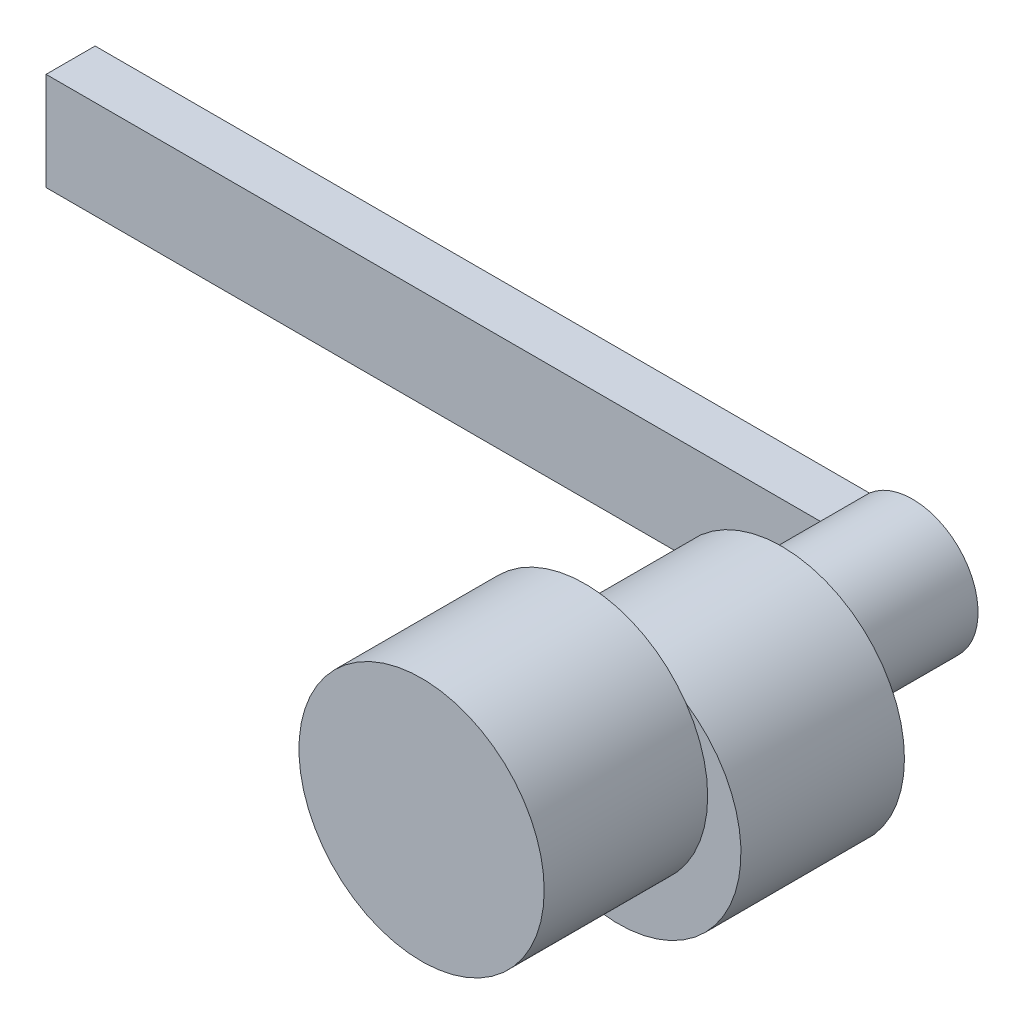
ISO-10303-21;
HEADER;
FILE_DESCRIPTION(('STEP AP214'),'2;1');
FILE_NAME('part.step','',(''),(''),'','','');
FILE_SCHEMA(('AUTOMOTIVE_DESIGN { 1 0 10303 214 1 1 1 1 }'));
ENDSEC;
DATA;
#1=APPLICATION_CONTEXT('core data for automotive mechanical design processes');
#2=APPLICATION_PROTOCOL_DEFINITION('international standard','automotive_design',2000,#1);
#3=PRODUCT_CONTEXT('',#1,'mechanical');
#4=PRODUCT('Part','Part','',(#3));
#5=PRODUCT_RELATED_PRODUCT_CATEGORY('part','',(#4));
#6=PRODUCT_DEFINITION_FORMATION('','',#4);
#7=PRODUCT_DEFINITION_CONTEXT('part definition',#1,'design');
#8=PRODUCT_DEFINITION('design','',#6,#7);
#9=PRODUCT_DEFINITION_SHAPE('','',#8);
#10=(LENGTH_UNIT() NAMED_UNIT(*) SI_UNIT(.MILLI.,.METRE.));
#11=(NAMED_UNIT(*) PLANE_ANGLE_UNIT() SI_UNIT($,.RADIAN.));
#12=(NAMED_UNIT(*) SI_UNIT($,.STERADIAN.) SOLID_ANGLE_UNIT());
#13=UNCERTAINTY_MEASURE_WITH_UNIT(LENGTH_MEASURE(1.E-05),#10,'distance_accuracy_value','');
#14=(GEOMETRIC_REPRESENTATION_CONTEXT(3) GLOBAL_UNCERTAINTY_ASSIGNED_CONTEXT((#13)) GLOBAL_UNIT_ASSIGNED_CONTEXT((#10,
#11,#12)) REPRESENTATION_CONTEXT('',''));
#15=CARTESIAN_POINT('',(0.,0.,0.));
#16=DIRECTION('',(0.,0.,1.));
#17=DIRECTION('',(1.,0.,0.));
#18=AXIS2_PLACEMENT_3D('',#15,#16,#17);
#19=CARTESIAN_POINT('',(2.,0.,20.));
#20=DIRECTION('',(0.,0.,1.));
#21=DIRECTION('',(1.,0.,0.));
#22=AXIS2_PLACEMENT_3D('',#19,#20,#21);
#23=PLANE('',#22);
#24=CARTESIAN_POINT('',(-0.0349048128745671,1.99969539031278,20.));
#25=DIRECTION('',(0.,0.,1.));
#26=DIRECTION('',(1.,0.,0.));
#27=AXIS2_PLACEMENT_3D('',#24,#25,#26);
#28=CIRCLE('',#27,7.5);
#29=CARTESIAN_POINT('',(-4.17831044124523,-4.25187959514378,20.));
#30=VERTEX_POINT('',#29);
#31=CARTESIAN_POINT('',(6.14340562837068,6.25157498545656,20.));
#32=VERTEX_POINT('',#31);
#33=EDGE_CURVE('E56',#30,#32,#28,.T.);
#34=ORIENTED_EDGE('',*,*,#33,.F.);
#35=CARTESIAN_POINT('',(2.,0.,20.));
#36=DIRECTION('',(0.,0.,1.));
#37=DIRECTION('',(1.,0.,0.));
#38=AXIS2_PLACEMENT_3D('',#35,#36,#37);
#39=CIRCLE('',#38,7.5);
#40=EDGE_CURVE('E268',#30,#32,#39,.T.);
#41=ORIENTED_EDGE('',*,*,#40,.T.);
#42=EDGE_LOOP('',(#34,#41));
#43=FACE_BOUND('',#42,.T.);
#44=ADVANCED_FACE('F46',(#43),#23,.T.);
#45=CARTESIAN_POINT('',(0.,0.,10.));
#46=DIRECTION('',(0.,0.,-1.));
#47=DIRECTION('',(-1.,0.,0.));
#48=AXIS2_PLACEMENT_3D('',#45,#46,#47);
#49=CYLINDRICAL_SURFACE('',#48,4.);
#50=CARTESIAN_POINT('',(0.,0.,0.));
#51=DIRECTION('',(0.,0.,1.));
#52=DIRECTION('',(1.,0.,0.));
#53=AXIS2_PLACEMENT_3D('',#50,#51,#52);
#54=CIRCLE('',#53,4.);
#55=CARTESIAN_POINT('',(-2.64575131106459,-3.,0.));
#56=VERTEX_POINT('',#55);
#57=CARTESIAN_POINT('',(-2.64575131106459,3.,0.));
#58=VERTEX_POINT('',#57);
#59=EDGE_CURVE('E267',#56,#58,#54,.T.);
#60=ORIENTED_EDGE('',*,*,#59,.T.);
#61=DIRECTION('',(0.,0.,-1.));
#62=VECTOR('',#61,1.);
#63=CARTESIAN_POINT('',(-2.64575131106459,3.,10.));
#64=LINE('',#63,#62);
#65=CARTESIAN_POINT('',(-2.64575131106459,3.,3.));
#66=VERTEX_POINT('',#65);
#67=EDGE_CURVE('E63',#58,#66,#64,.F.);
#68=ORIENTED_EDGE('',*,*,#67,.T.);
#69=CARTESIAN_POINT('',(0.,0.,3.));
#70=DIRECTION('',(0.,0.,-1.));
#71=DIRECTION('',(-1.,0.,0.));
#72=AXIS2_PLACEMENT_3D('',#69,#70,#71);
#73=CIRCLE('',#72,4.);
#74=CARTESIAN_POINT('',(-2.64575131106459,-3.,3.));
#75=VERTEX_POINT('',#74);
#76=EDGE_CURVE('E11',#75,#66,#73,.T.);
#77=ORIENTED_EDGE('',*,*,#76,.F.);
#78=DIRECTION('',(0.,0.,-1.));
#79=VECTOR('',#78,1.);
#80=CARTESIAN_POINT('',(-2.64575131106459,-3.,10.));
#81=LINE('',#80,#79);
#82=EDGE_CURVE('E140',#75,#56,#81,.T.);
#83=ORIENTED_EDGE('',*,*,#82,.T.);
#84=EDGE_LOOP('',(#60,#68,#77,#83));
#85=FACE_BOUND('',#84,.T.);
#86=CARTESIAN_POINT('',(0.,0.,10.));
#87=DIRECTION('',(0.,0.,1.));
#88=DIRECTION('',(1.,0.,0.));
#89=AXIS2_PLACEMENT_3D('',#86,#87,#88);
#90=CIRCLE('',#89,4.);
#91=CARTESIAN_POINT('',(4.,0.,10.));
#92=VERTEX_POINT('',#91);
#93=EDGE_CURVE('E272',#92,#92,#90,.T.);
#94=ORIENTED_EDGE('',*,*,#93,.F.);
#95=EDGE_LOOP('',(#94));
#96=FACE_BOUND('',#95,.T.);
#97=ADVANCED_FACE('F48',(#85,#96),#49,.T.);
#98=CARTESIAN_POINT('',(0.,0.,0.));
#99=DIRECTION('',(0.,0.,1.));
#100=DIRECTION('',(1.,0.,0.));
#101=AXIS2_PLACEMENT_3D('',#98,#99,#100);
#102=PLANE('',#101);
#103=ORIENTED_EDGE('',*,*,#59,.F.);
#104=DIRECTION('',(-1.,0.,0.));
#105=VECTOR('',#104,1.);
#106=CARTESIAN_POINT('',(0.,-3.,0.));
#107=LINE('',#106,#105);
#108=CARTESIAN_POINT('',(-50.,-3.,0.));
#109=VERTEX_POINT('',#108);
#110=EDGE_CURVE('E164',#56,#109,#107,.T.);
#111=ORIENTED_EDGE('',*,*,#110,.T.);
#112=DIRECTION('',(0.,1.,0.));
#113=VECTOR('',#112,1.);
#114=CARTESIAN_POINT('',(-50.,3.,0.));
#115=LINE('',#114,#113);
#116=CARTESIAN_POINT('',(-50.,3.,0.));
#117=VERTEX_POINT('',#116);
#118=EDGE_CURVE('E152',#109,#117,#115,.T.);
#119=ORIENTED_EDGE('',*,*,#118,.T.);
#120=DIRECTION('',(1.,0.,0.));
#121=VECTOR('',#120,1.);
#122=CARTESIAN_POINT('',(0.,3.,0.));
#123=LINE('',#122,#121);
#124=EDGE_CURVE('E145',#117,#58,#123,.T.);
#125=ORIENTED_EDGE('',*,*,#124,.T.);
#126=EDGE_LOOP('',(#103,#111,#119,#125));
#127=FACE_BOUND('',#126,.T.);
#128=ADVANCED_FACE('F281',(#127),#102,.F.);
#129=CARTESIAN_POINT('',(2.,0.,20.));
#130=DIRECTION('',(0.,0.,-1.));
#131=DIRECTION('',(-1.,0.,0.));
#132=AXIS2_PLACEMENT_3D('',#129,#130,#131);
#133=CYLINDRICAL_SURFACE('',#132,7.5);
#134=EDGE_CURVE('E263',#32,#30,#39,.T.);
#135=ORIENTED_EDGE('',*,*,#134,.F.);
#136=ORIENTED_EDGE('',*,*,#40,.F.);
#137=EDGE_LOOP('',(#135,#136));
#138=FACE_BOUND('',#137,.T.);
#139=CARTESIAN_POINT('',(2.,0.,10.));
#140=DIRECTION('',(0.,0.,1.));
#141=DIRECTION('',(1.,0.,0.));
#142=AXIS2_PLACEMENT_3D('',#139,#140,#141);
#143=CIRCLE('',#142,7.5);
#144=CARTESIAN_POINT('',(9.5,0.,10.));
#145=VERTEX_POINT('',#144);
#146=EDGE_CURVE('E243',#145,#145,#143,.T.);
#147=ORIENTED_EDGE('',*,*,#146,.T.);
#148=EDGE_LOOP('',(#147));
#149=FACE_BOUND('',#148,.T.);
#150=ADVANCED_FACE('F283',(#138,#149),#133,.T.);
#151=CARTESIAN_POINT('',(2.,0.,10.));
#152=DIRECTION('',(0.,0.,1.));
#153=DIRECTION('',(1.,0.,0.));
#154=AXIS2_PLACEMENT_3D('',#151,#152,#153);
#155=PLANE('',#154);
#156=ORIENTED_EDGE('',*,*,#93,.T.);
#157=EDGE_LOOP('',(#156));
#158=FACE_BOUND('',#157,.T.);
#159=ORIENTED_EDGE('',*,*,#146,.F.);
#160=EDGE_LOOP('',(#159));
#161=FACE_BOUND('',#160,.T.);
#162=ADVANCED_FACE('F288',(#158,#161),#155,.F.);
#163=CARTESIAN_POINT('',(-0.0349048128745671,1.99969539031278,30.));
#164=DIRECTION('',(0.,0.,1.));
#165=DIRECTION('',(1.,0.,0.));
#166=AXIS2_PLACEMENT_3D('',#163,#164,#165);
#167=PLANE('',#166);
#168=CARTESIAN_POINT('',(-0.0349048128745671,1.99969539031278,30.));
#169=DIRECTION('',(0.,0.,1.));
#170=DIRECTION('',(1.,0.,0.));
#171=AXIS2_PLACEMENT_3D('',#168,#169,#170);
#172=CIRCLE('',#171,7.5);
#173=CARTESIAN_POINT('',(7.46509518712543,1.99969539031278,30.));
#174=VERTEX_POINT('',#173);
#175=EDGE_CURVE('E179',#174,#174,#172,.T.);
#176=ORIENTED_EDGE('',*,*,#175,.T.);
#177=EDGE_LOOP('',(#176));
#178=FACE_BOUND('',#177,.T.);
#179=ADVANCED_FACE('F301',(#178),#167,.T.);
#180=CARTESIAN_POINT('',(-0.0349048128745671,1.99969539031278,30.));
#181=DIRECTION('',(0.,0.,-1.));
#182=DIRECTION('',(-1.,0.,0.));
#183=AXIS2_PLACEMENT_3D('',#180,#181,#182);
#184=CYLINDRICAL_SURFACE('',#183,7.5);
#185=ORIENTED_EDGE('',*,*,#175,.F.);
#186=EDGE_LOOP('',(#185));
#187=FACE_BOUND('',#186,.T.);
#188=EDGE_CURVE('E178',#32,#30,#28,.T.);
#189=ORIENTED_EDGE('',*,*,#188,.T.);
#190=ORIENTED_EDGE('',*,*,#33,.T.);
#191=EDGE_LOOP('',(#189,#190));
#192=FACE_BOUND('',#191,.T.);
#193=ADVANCED_FACE('F306',(#187,#192),#184,.T.);
#194=CARTESIAN_POINT('',(-0.0349048128745671,1.99969539031278,20.));
#195=DIRECTION('',(0.,0.,1.));
#196=DIRECTION('',(1.,0.,0.));
#197=AXIS2_PLACEMENT_3D('',#194,#195,#196);
#198=PLANE('',#197);
#199=ORIENTED_EDGE('',*,*,#188,.F.);
#200=ORIENTED_EDGE('',*,*,#134,.T.);
#201=EDGE_LOOP('',(#199,#200));
#202=FACE_BOUND('',#201,.T.);
#203=ADVANCED_FACE('F316',(#202),#198,.F.);
#204=CARTESIAN_POINT('',(0.,3.,3.));
#205=DIRECTION('',(0.,1.,0.));
#206=DIRECTION('',(0.,0.,1.));
#207=AXIS2_PLACEMENT_3D('',#204,#205,#206);
#208=PLANE('',#207);
#209=ORIENTED_EDGE('',*,*,#67,.F.);
#210=ORIENTED_EDGE('',*,*,#124,.F.);
#211=DIRECTION('',(0.,0.,-1.));
#212=VECTOR('',#211,1.);
#213=CARTESIAN_POINT('',(-50.,3.,3.));
#214=LINE('',#213,#212);
#215=CARTESIAN_POINT('',(-50.,3.,3.));
#216=VERTEX_POINT('',#215);
#217=EDGE_CURVE('E154',#216,#117,#214,.T.);
#218=ORIENTED_EDGE('',*,*,#217,.F.);
#219=DIRECTION('',(1.,0.,0.));
#220=VECTOR('',#219,1.);
#221=CARTESIAN_POINT('',(0.,3.,3.));
#222=LINE('',#221,#220);
#223=EDGE_CURVE('E155',#216,#66,#222,.T.);
#224=ORIENTED_EDGE('',*,*,#223,.T.);
#225=EDGE_LOOP('',(#209,#210,#218,#224));
#226=FACE_BOUND('',#225,.T.);
#227=ADVANCED_FACE('F280',(#226),#208,.T.);
#228=CARTESIAN_POINT('',(0.,-3.,3.));
#229=DIRECTION('',(0.,-1.,0.));
#230=DIRECTION('',(0.,0.,-1.));
#231=AXIS2_PLACEMENT_3D('',#228,#229,#230);
#232=PLANE('',#231);
#233=ORIENTED_EDGE('',*,*,#82,.F.);
#234=DIRECTION('',(-1.,0.,0.));
#235=VECTOR('',#234,1.);
#236=CARTESIAN_POINT('',(0.,-3.,3.));
#237=LINE('',#236,#235);
#238=CARTESIAN_POINT('',(-50.,-3.,3.));
#239=VERTEX_POINT('',#238);
#240=EDGE_CURVE('E134',#75,#239,#237,.T.);
#241=ORIENTED_EDGE('',*,*,#240,.T.);
#242=DIRECTION('',(0.,0.,-1.));
#243=VECTOR('',#242,1.);
#244=CARTESIAN_POINT('',(-50.,-3.,3.));
#245=LINE('',#244,#243);
#246=EDGE_CURVE('E138',#239,#109,#245,.T.);
#247=ORIENTED_EDGE('',*,*,#246,.T.);
#248=ORIENTED_EDGE('',*,*,#110,.F.);
#249=EDGE_LOOP('',(#233,#241,#247,#248));
#250=FACE_BOUND('',#249,.T.);
#251=ADVANCED_FACE('F136',(#250),#232,.T.);
#252=CARTESIAN_POINT('',(-50.,3.,3.));
#253=DIRECTION('',(-1.,0.,0.));
#254=DIRECTION('',(0.,0.,1.));
#255=AXIS2_PLACEMENT_3D('',#252,#253,#254);
#256=PLANE('',#255);
#257=ORIENTED_EDGE('',*,*,#118,.F.);
#258=ORIENTED_EDGE('',*,*,#246,.F.);
#259=DIRECTION('',(0.,1.,0.));
#260=VECTOR('',#259,1.);
#261=CARTESIAN_POINT('',(-50.,3.,3.));
#262=LINE('',#261,#260);
#263=EDGE_CURVE('E144',#239,#216,#262,.T.);
#264=ORIENTED_EDGE('',*,*,#263,.T.);
#265=ORIENTED_EDGE('',*,*,#217,.T.);
#266=EDGE_LOOP('',(#257,#258,#264,#265));
#267=FACE_BOUND('',#266,.T.);
#268=ADVANCED_FACE('F149',(#267),#256,.T.);
#269=CARTESIAN_POINT('',(0.,0.,3.));
#270=DIRECTION('',(0.,0.,-1.));
#271=DIRECTION('',(-1.,0.,0.));
#272=AXIS2_PLACEMENT_3D('',#269,#270,#271);
#273=PLANE('',#272);
#274=ORIENTED_EDGE('',*,*,#240,.F.);
#275=ORIENTED_EDGE('',*,*,#76,.T.);
#276=ORIENTED_EDGE('',*,*,#223,.F.);
#277=ORIENTED_EDGE('',*,*,#263,.F.);
#278=EDGE_LOOP('',(#274,#275,#276,#277));
#279=FACE_BOUND('',#278,.T.);
#280=ADVANCED_FACE('F157',(#279),#273,.F.);
#281=CLOSED_SHELL('',(#44,#97,#128,#150,#162,#179,#193,#203,#227,#251,#268,#280));
#282=DIRECTION('',(0.,-1.,0.));
#283=VECTOR('',#282,1.);
#284=CARTESIAN_POINT('',(-0.232233047033646,0.,20.));
#285=LINE('',#284,#283);
#286=CARTESIAN_POINT('',(-0.232233047033646,-0.5,20.));
#287=VERTEX_POINT('',#286);
#288=CARTESIAN_POINT('',(-0.232233047033646,-1.76776695296639,20.));
#289=VERTEX_POINT('',#288);
#290=EDGE_CURVE('E220',#287,#289,#285,.T.);
#291=ORIENTED_EDGE('',*,*,#290,.T.);
#292=DIRECTION('',(-0.707106781186541,0.707106781186554,0.));
#293=VECTOR('',#292,1.);
#294=CARTESIAN_POINT('',(-1.00000000000002,-1.,20.));
#295=LINE('',#294,#293);
#296=CARTESIAN_POINT('',(-2.,0.,20.));
#297=VERTEX_POINT('',#296);
#298=EDGE_CURVE('E216',#289,#297,#295,.T.);
#299=ORIENTED_EDGE('',*,*,#298,.T.);
#300=DIRECTION('',(0.707106781186541,0.707106781186554,0.));
#301=VECTOR('',#300,1.);
#302=CARTESIAN_POINT('',(-1.00000000000002,1.,20.));
#303=LINE('',#302,#301);
#304=CARTESIAN_POINT('',(-0.232233047033647,1.76776695296639,20.));
#305=VERTEX_POINT('',#304);
#306=EDGE_CURVE('E183',#297,#305,#303,.T.);
#307=ORIENTED_EDGE('',*,*,#306,.T.);
#308=DIRECTION('',(0.,-1.,0.));
#309=VECTOR('',#308,1.);
#310=CARTESIAN_POINT('',(-0.232233047033646,0.,20.));
#311=LINE('',#310,#309);
#312=CARTESIAN_POINT('',(-0.232233047033646,0.5,20.));
#313=VERTEX_POINT('',#312);
#314=EDGE_CURVE('E192',#305,#313,#311,.T.);
#315=ORIENTED_EDGE('',*,*,#314,.T.);
#316=DIRECTION('',(-1.,0.,0.));
#317=VECTOR('',#316,1.);
#318=CARTESIAN_POINT('',(0.,0.5,20.));
#319=LINE('',#318,#317);
#320=CARTESIAN_POINT('',(2.,0.5,20.));
#321=VERTEX_POINT('',#320);
#322=EDGE_CURVE('E232',#321,#313,#319,.T.);
#323=ORIENTED_EDGE('',*,*,#322,.F.);
#324=DIRECTION('',(0.,1.,0.));
#325=VECTOR('',#324,1.);
#326=CARTESIAN_POINT('',(2.,0.,20.));
#327=LINE('',#326,#325);
#328=CARTESIAN_POINT('',(2.,-0.5,20.));
#329=VERTEX_POINT('',#328);
#330=EDGE_CURVE('E228',#329,#321,#327,.T.);
#331=ORIENTED_EDGE('',*,*,#330,.F.);
#332=DIRECTION('',(-1.,0.,0.));
#333=VECTOR('',#332,1.);
#334=CARTESIAN_POINT('',(0.,-0.5,20.));
#335=LINE('',#334,#333);
#336=EDGE_CURVE('E224',#329,#287,#335,.T.);
#337=ORIENTED_EDGE('',*,*,#336,.T.);
#338=EDGE_LOOP('',(#291,#299,#307,#315,#323,#331,#337));
#339=FACE_BOUND('',#338,.T.);
#340=ADVANCED_FACE('F324',(#339),#198,.F.);
#341=CARTESIAN_POINT('',(0.,0.,19.9));
#342=DIRECTION('',(0.,0.,1.));
#343=DIRECTION('',(1.,0.,0.));
#344=AXIS2_PLACEMENT_3D('',#341,#342,#343);
#345=PLANE('',#344);
#346=DIRECTION('',(0.707106781186541,0.707106781186554,0.));
#347=VECTOR('',#346,1.);
#348=CARTESIAN_POINT('',(-1.00000000000002,1.,19.9));
#349=LINE('',#348,#347);
#350=CARTESIAN_POINT('',(-2.,0.,19.9));
#351=VERTEX_POINT('',#350);
#352=CARTESIAN_POINT('',(-0.232233047033647,1.76776695296639,19.9));
#353=VERTEX_POINT('',#352);
#354=EDGE_CURVE('E187',#351,#353,#349,.T.);
#355=ORIENTED_EDGE('',*,*,#354,.F.);
#356=DIRECTION('',(-0.707106781186541,0.707106781186554,0.));
#357=VECTOR('',#356,1.);
#358=CARTESIAN_POINT('',(-1.00000000000002,-1.,19.9));
#359=LINE('',#358,#357);
#360=CARTESIAN_POINT('',(-0.232233047033646,-1.76776695296639,19.9));
#361=VERTEX_POINT('',#360);
#362=EDGE_CURVE('E191',#361,#351,#359,.T.);
#363=ORIENTED_EDGE('',*,*,#362,.F.);
#364=DIRECTION('',(0.,-1.,0.));
#365=VECTOR('',#364,1.);
#366=CARTESIAN_POINT('',(-0.232233047033646,0.,19.9));
#367=LINE('',#366,#365);
#368=CARTESIAN_POINT('',(-0.232233047033646,-0.5,19.9));
#369=VERTEX_POINT('',#368);
#370=EDGE_CURVE('E195',#369,#361,#367,.T.);
#371=ORIENTED_EDGE('',*,*,#370,.F.);
#372=DIRECTION('',(-1.,0.,0.));
#373=VECTOR('',#372,1.);
#374=CARTESIAN_POINT('',(0.,-0.5,19.9));
#375=LINE('',#374,#373);
#376=CARTESIAN_POINT('',(2.,-0.5,19.9));
#377=VERTEX_POINT('',#376);
#378=EDGE_CURVE('E198',#377,#369,#375,.T.);
#379=ORIENTED_EDGE('',*,*,#378,.F.);
#380=DIRECTION('',(0.,1.,0.));
#381=VECTOR('',#380,1.);
#382=CARTESIAN_POINT('',(2.,0.,19.9));
#383=LINE('',#382,#381);
#384=CARTESIAN_POINT('',(2.,0.5,19.9));
#385=VERTEX_POINT('',#384);
#386=EDGE_CURVE('E201',#377,#385,#383,.T.);
#387=ORIENTED_EDGE('',*,*,#386,.T.);
#388=DIRECTION('',(-1.,0.,0.));
#389=VECTOR('',#388,1.);
#390=CARTESIAN_POINT('',(0.,0.5,19.9));
#391=LINE('',#390,#389);
#392=CARTESIAN_POINT('',(-0.232233047033646,0.5,19.9));
#393=VERTEX_POINT('',#392);
#394=EDGE_CURVE('E205',#385,#393,#391,.T.);
#395=ORIENTED_EDGE('',*,*,#394,.T.);
#396=DIRECTION('',(0.,-1.,0.));
#397=VECTOR('',#396,1.);
#398=CARTESIAN_POINT('',(-0.232233047033646,0.,19.9));
#399=LINE('',#398,#397);
#400=EDGE_CURVE('E209',#353,#393,#399,.T.);
#401=ORIENTED_EDGE('',*,*,#400,.F.);
#402=EDGE_LOOP('',(#355,#363,#371,#379,#387,#395,#401));
#403=FACE_BOUND('',#402,.T.);
#404=ADVANCED_FACE('F326',(#403),#345,.T.);
#405=CARTESIAN_POINT('',(-0.232233047033646,0.,19.9));
#406=DIRECTION('',(-1.,0.,0.));
#407=DIRECTION('',(0.,-1.,0.));
#408=AXIS2_PLACEMENT_3D('',#405,#406,#407);
#409=PLANE('',#408);
#410=ORIENTED_EDGE('',*,*,#290,.F.);
#411=DIRECTION('',(0.,0.,1.));
#412=VECTOR('',#411,1.);
#413=CARTESIAN_POINT('',(-0.232233047033646,-0.5,19.9));
#414=LINE('',#413,#412);
#415=EDGE_CURVE('E253',#369,#287,#414,.T.);
#416=ORIENTED_EDGE('',*,*,#415,.F.);
#417=ORIENTED_EDGE('',*,*,#370,.T.);
#418=DIRECTION('',(0.,0.,1.));
#419=VECTOR('',#418,1.);
#420=CARTESIAN_POINT('',(-0.232233047033646,-1.76776695296639,19.9));
#421=LINE('',#420,#419);
#422=EDGE_CURVE('E256',#361,#289,#421,.T.);
#423=ORIENTED_EDGE('',*,*,#422,.T.);
#424=EDGE_LOOP('',(#410,#416,#417,#423));
#425=FACE_BOUND('',#424,.T.);
#426=ADVANCED_FACE('F329',(#425),#409,.T.);
#427=CARTESIAN_POINT('',(0.,-0.5,19.9));
#428=DIRECTION('',(0.,1.,0.));
#429=DIRECTION('',(-1.,0.,0.));
#430=AXIS2_PLACEMENT_3D('',#427,#428,#429);
#431=PLANE('',#430);
#432=ORIENTED_EDGE('',*,*,#336,.F.);
#433=DIRECTION('',(0.,0.,1.));
#434=VECTOR('',#433,1.);
#435=CARTESIAN_POINT('',(2.,-0.5,19.9));
#436=LINE('',#435,#434);
#437=EDGE_CURVE('E250',#377,#329,#436,.T.);
#438=ORIENTED_EDGE('',*,*,#437,.F.);
#439=ORIENTED_EDGE('',*,*,#378,.T.);
#440=ORIENTED_EDGE('',*,*,#415,.T.);
#441=EDGE_LOOP('',(#432,#438,#439,#440));
#442=FACE_BOUND('',#441,.T.);
#443=ADVANCED_FACE('F343',(#442),#431,.T.);
#444=CARTESIAN_POINT('',(2.,0.,19.9));
#445=DIRECTION('',(1.,0.,0.));
#446=DIRECTION('',(0.,0.,-1.));
#447=AXIS2_PLACEMENT_3D('',#444,#445,#446);
#448=PLANE('',#447);
#449=ORIENTED_EDGE('',*,*,#330,.T.);
#450=DIRECTION('',(0.,0.,1.));
#451=VECTOR('',#450,1.);
#452=CARTESIAN_POINT('',(2.,0.5,19.9));
#453=LINE('',#452,#451);
#454=EDGE_CURVE('E247',#385,#321,#453,.T.);
#455=ORIENTED_EDGE('',*,*,#454,.F.);
#456=ORIENTED_EDGE('',*,*,#386,.F.);
#457=ORIENTED_EDGE('',*,*,#437,.T.);
#458=EDGE_LOOP('',(#449,#455,#456,#457));
#459=FACE_BOUND('',#458,.T.);
#460=ADVANCED_FACE('F339',(#459),#448,.F.);
#461=CARTESIAN_POINT('',(0.,0.5,19.9));
#462=DIRECTION('',(0.,1.,0.));
#463=DIRECTION('',(-1.,0.,0.));
#464=AXIS2_PLACEMENT_3D('',#461,#462,#463);
#465=PLANE('',#464);
#466=ORIENTED_EDGE('',*,*,#322,.T.);
#467=DIRECTION('',(0.,0.,1.));
#468=VECTOR('',#467,1.);
#469=CARTESIAN_POINT('',(-0.232233047033646,0.5,19.9));
#470=LINE('',#469,#468);
#471=EDGE_CURVE('E244',#393,#313,#470,.T.);
#472=ORIENTED_EDGE('',*,*,#471,.F.);
#473=ORIENTED_EDGE('',*,*,#394,.F.);
#474=ORIENTED_EDGE('',*,*,#454,.T.);
#475=EDGE_LOOP('',(#466,#472,#473,#474));
#476=FACE_BOUND('',#475,.T.);
#477=ADVANCED_FACE('F335',(#476),#465,.F.);
#478=CARTESIAN_POINT('',(-0.232233047033646,0.,19.9));
#479=DIRECTION('',(-1.,0.,0.));
#480=DIRECTION('',(0.,-1.,0.));
#481=AXIS2_PLACEMENT_3D('',#478,#479,#480);
#482=PLANE('',#481);
#483=ORIENTED_EDGE('',*,*,#314,.F.);
#484=DIRECTION('',(0.,0.,1.));
#485=VECTOR('',#484,1.);
#486=CARTESIAN_POINT('',(-0.232233047033647,1.76776695296639,19.9));
#487=LINE('',#486,#485);
#488=EDGE_CURVE('E239',#353,#305,#487,.T.);
#489=ORIENTED_EDGE('',*,*,#488,.F.);
#490=ORIENTED_EDGE('',*,*,#400,.T.);
#491=ORIENTED_EDGE('',*,*,#471,.T.);
#492=EDGE_LOOP('',(#483,#489,#490,#491));
#493=FACE_BOUND('',#492,.T.);
#494=ADVANCED_FACE('F332',(#493),#482,.T.);
#495=CARTESIAN_POINT('',(-1.00000000000002,1.,19.9));
#496=DIRECTION('',(0.707106781186554,-0.707106781186541,0.));
#497=DIRECTION('',(0.707106781186541,0.707106781186554,0.));
#498=AXIS2_PLACEMENT_3D('',#495,#496,#497);
#499=PLANE('',#498);
#500=ORIENTED_EDGE('',*,*,#306,.F.);
#501=DIRECTION('',(0.,0.,1.));
#502=VECTOR('',#501,1.);
#503=CARTESIAN_POINT('',(-2.,0.,19.9));
#504=LINE('',#503,#502);
#505=EDGE_CURVE('E212',#351,#297,#504,.T.);
#506=ORIENTED_EDGE('',*,*,#505,.F.);
#507=ORIENTED_EDGE('',*,*,#354,.T.);
#508=ORIENTED_EDGE('',*,*,#488,.T.);
#509=EDGE_LOOP('',(#500,#506,#507,#508));
#510=FACE_BOUND('',#509,.T.);
#511=ADVANCED_FACE('F298',(#510),#499,.T.);
#512=CARTESIAN_POINT('',(-1.00000000000002,-1.,19.9));
#513=DIRECTION('',(0.707106781186554,0.707106781186541,0.));
#514=DIRECTION('',(-0.707106781186541,0.707106781186554,0.));
#515=AXIS2_PLACEMENT_3D('',#512,#513,#514);
#516=PLANE('',#515);
#517=ORIENTED_EDGE('',*,*,#298,.F.);
#518=ORIENTED_EDGE('',*,*,#422,.F.);
#519=ORIENTED_EDGE('',*,*,#362,.T.);
#520=ORIENTED_EDGE('',*,*,#505,.T.);
#521=EDGE_LOOP('',(#517,#518,#519,#520));
#522=FACE_BOUND('',#521,.T.);
#523=ADVANCED_FACE('F350',(#522),#516,.T.);
#524=CLOSED_SHELL('',(#340,#404,#426,#443,#460,#477,#494,#511,#523));
#525=ORIENTED_CLOSED_SHELL('',*,#524,.T.);
#526=BREP_WITH_VOIDS('B2',#281,(#525));
#527=ADVANCED_BREP_SHAPE_REPRESENTATION('',(#18,#526),#14);
#528=SHAPE_DEFINITION_REPRESENTATION(#9,#527);
ENDSEC;
END-ISO-10303-21;
